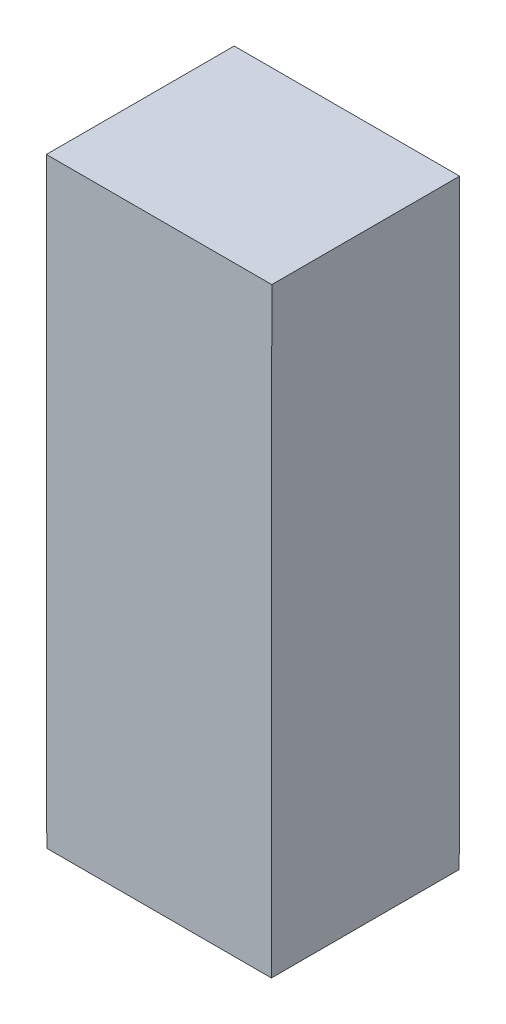
ISO-10303-21;
HEADER;
FILE_DESCRIPTION(('STEP AP214'),'2;1');
FILE_NAME('part.step','',(''),(''),'','','');
FILE_SCHEMA(('AUTOMOTIVE_DESIGN { 1 0 10303 214 1 1 1 1 }'));
ENDSEC;
DATA;
#1=APPLICATION_CONTEXT('core data for automotive mechanical design processes');
#2=APPLICATION_PROTOCOL_DEFINITION('international standard','automotive_design',2000,#1);
#3=PRODUCT_CONTEXT('',#1,'mechanical');
#4=PRODUCT('Part','Part','',(#3));
#5=PRODUCT_RELATED_PRODUCT_CATEGORY('part','',(#4));
#6=PRODUCT_DEFINITION_FORMATION('','',#4);
#7=PRODUCT_DEFINITION_CONTEXT('part definition',#1,'design');
#8=PRODUCT_DEFINITION('design','',#6,#7);
#9=PRODUCT_DEFINITION_SHAPE('','',#8);
#10=(LENGTH_UNIT() NAMED_UNIT(*) SI_UNIT(.MILLI.,.METRE.));
#11=(NAMED_UNIT(*) PLANE_ANGLE_UNIT() SI_UNIT($,.RADIAN.));
#12=(NAMED_UNIT(*) SI_UNIT($,.STERADIAN.) SOLID_ANGLE_UNIT());
#13=UNCERTAINTY_MEASURE_WITH_UNIT(LENGTH_MEASURE(1.E-05),#10,'distance_accuracy_value','');
#14=(GEOMETRIC_REPRESENTATION_CONTEXT(3) GLOBAL_UNCERTAINTY_ASSIGNED_CONTEXT((#13)) GLOBAL_UNIT_ASSIGNED_CONTEXT((#10,
#11,#12)) REPRESENTATION_CONTEXT('',''));
#15=CARTESIAN_POINT('',(0.,0.,0.));
#16=DIRECTION('',(0.,0.,1.));
#17=DIRECTION('',(1.,0.,0.));
#18=AXIS2_PLACEMENT_3D('',#15,#16,#17);
#19=CARTESIAN_POINT('',(-0.1494917,-0.39974266,0.2499995));
#20=DIRECTION('',(0.,0.,1.));
#21=DIRECTION('',(1.,0.,0.));
#22=AXIS2_PLACEMENT_3D('',#19,#20,#21);
#23=PLANE('',#22);
#24=DIRECTION('',(1.,0.,0.));
#25=VECTOR('',#24,1.);
#26=CARTESIAN_POINT('',(-0.1499997,0.3997452,0.2499995));
#27=LINE('',#26,#25);
#28=CARTESIAN_POINT('',(-0.149999700000003,0.3997452,0.2499995));
#29=VERTEX_POINT('',#28);
#30=CARTESIAN_POINT('',(0.1499997,0.3997452,0.2499995));
#31=VERTEX_POINT('',#30);
#32=EDGE_CURVE('E87',#29,#31,#27,.T.);
#33=ORIENTED_EDGE('',*,*,#32,.F.);
#34=DIRECTION('',(0.000635406643273413,-0.999999798129178,0.));
#35=VECTOR('',#34,1.);
#36=CARTESIAN_POINT('',(-0.1494917,-0.39974266,0.2499995));
#37=LINE('',#36,#35);
#38=CARTESIAN_POINT('',(-0.1494917,-0.399742660000002,0.2499995));
#39=VERTEX_POINT('',#38);
#40=EDGE_CURVE('E76',#39,#29,#37,.F.);
#41=ORIENTED_EDGE('',*,*,#40,.F.);
#42=DIRECTION('',(0.999999999855655,-1.69909098406741E-05,0.));
#43=VECTOR('',#42,1.);
#44=CARTESIAN_POINT('',(0.,-0.3997452,0.2499995));
#45=LINE('',#44,#43);
#46=CARTESIAN_POINT('',(0.,-0.399745199999999,0.2499995));
#47=VERTEX_POINT('',#46);
#48=EDGE_CURVE('E20',#47,#39,#45,.F.);
#49=ORIENTED_EDGE('',*,*,#48,.F.);
#50=DIRECTION('',(0.999999999855655,1.69909098406741E-05,0.));
#51=VECTOR('',#50,1.);
#52=CARTESIAN_POINT('',(0.1494917,-0.39974266,0.2499995));
#53=LINE('',#52,#51);
#54=CARTESIAN_POINT('',(0.149491699193034,-0.39974393,0.2499995));
#55=VERTEX_POINT('',#54);
#56=EDGE_CURVE('E65',#55,#47,#53,.F.);
#57=ORIENTED_EDGE('',*,*,#56,.F.);
#58=DIRECTION('',(0.000635406643255613,0.999999798129178,0.));
#59=VECTOR('',#58,1.);
#60=CARTESIAN_POINT('',(0.1499997,0.3997452,0.2499995));
#61=LINE('',#60,#59);
#62=EDGE_CURVE('E60',#31,#55,#61,.F.);
#63=ORIENTED_EDGE('',*,*,#62,.F.);
#64=EDGE_LOOP('',(#33,#41,#49,#57,#63));
#65=FACE_BOUND('',#64,.T.);
#66=ADVANCED_FACE('F17',(#65),#23,.T.);
#67=CARTESIAN_POINT('',(0.,-0.3997452,0.));
#68=DIRECTION('',(-1.69909098406741E-05,-0.999999999855655,0.));
#69=DIRECTION('',(0.999999999855655,-1.69909098406741E-05,0.));
#70=AXIS2_PLACEMENT_3D('',#67,#68,#69);
#71=PLANE('',#70);
#72=DIRECTION('',(0.,0.,1.));
#73=VECTOR('',#72,1.);
#74=CARTESIAN_POINT('',(-0.1494917,-0.39974266,0.));
#75=LINE('',#74,#73);
#76=CARTESIAN_POINT('',(-0.1494917,-0.399742660000002,0.));
#77=VERTEX_POINT('',#76);
#78=EDGE_CURVE('E91',#77,#39,#75,.T.);
#79=ORIENTED_EDGE('',*,*,#78,.F.);
#80=DIRECTION('',(1.,0.,0.));
#81=VECTOR('',#80,1.);
#82=CARTESIAN_POINT('',(-0.1494917,-0.39974266,0.));
#83=LINE('',#82,#81);
#84=CARTESIAN_POINT('',(0.,-0.399745199999999,0.));
#85=VERTEX_POINT('',#84);
#86=EDGE_CURVE('E82',#77,#85,#83,.T.);
#87=ORIENTED_EDGE('',*,*,#86,.T.);
#88=DIRECTION('',(0.,0.,1.));
#89=VECTOR('',#88,1.);
#90=CARTESIAN_POINT('',(0.,-0.399745199999997,0.));
#91=LINE('',#90,#89);
#92=EDGE_CURVE('E70',#47,#85,#91,.F.);
#93=ORIENTED_EDGE('',*,*,#92,.F.);
#94=ORIENTED_EDGE('',*,*,#48,.T.);
#95=EDGE_LOOP('',(#79,#87,#93,#94));
#96=FACE_BOUND('',#95,.T.);
#97=ADVANCED_FACE('F81',(#96),#71,.T.);
#98=CARTESIAN_POINT('',(0.1494917,-0.39974266,0.));
#99=DIRECTION('',(1.69909098406741E-05,-0.999999999855655,0.));
#100=DIRECTION('',(0.999999999855655,1.69909098406741E-05,0.));
#101=AXIS2_PLACEMENT_3D('',#98,#99,#100);
#102=PLANE('',#101);
#103=ORIENTED_EDGE('',*,*,#92,.T.);
#104=DIRECTION('',(1.,0.,0.));
#105=VECTOR('',#104,1.);
#106=CARTESIAN_POINT('',(-0.1494917,-0.3997452,0.));
#107=LINE('',#106,#105);
#108=CARTESIAN_POINT('',(0.149491699596518,-0.399743295,0.));
#109=VERTEX_POINT('',#108);
#110=EDGE_CURVE('E96',#85,#109,#107,.T.);
#111=ORIENTED_EDGE('',*,*,#110,.T.);
#112=DIRECTION('',(0.,0.,1.));
#113=VECTOR('',#112,1.);
#114=CARTESIAN_POINT('',(0.149491700000003,-0.39974266,0.));
#115=LINE('',#114,#113);
#116=EDGE_CURVE('E72',#55,#109,#115,.F.);
#117=ORIENTED_EDGE('',*,*,#116,.F.);
#118=ORIENTED_EDGE('',*,*,#56,.T.);
#119=EDGE_LOOP('',(#103,#111,#117,#118));
#120=FACE_BOUND('',#119,.T.);
#121=ADVANCED_FACE('F67',(#120),#102,.T.);
#122=CARTESIAN_POINT('',(0.1499997,0.3997452,0.));
#123=DIRECTION('',(0.999999798129178,-0.000635406643255613,0.));
#124=DIRECTION('',(0.000635406643255613,0.999999798129178,0.));
#125=AXIS2_PLACEMENT_3D('',#122,#123,#124);
#126=PLANE('',#125);
#127=ORIENTED_EDGE('',*,*,#116,.T.);
#128=DIRECTION('',(0.000635406643259914,0.999999798129178,0.));
#129=VECTOR('',#128,1.);
#130=CARTESIAN_POINT('',(0.1494917,-0.39974266,0.));
#131=LINE('',#130,#129);
#132=CARTESIAN_POINT('',(0.1499997,0.3997452,0.));
#133=VERTEX_POINT('',#132);
#134=EDGE_CURVE('E98',#109,#133,#131,.T.);
#135=ORIENTED_EDGE('',*,*,#134,.T.);
#136=DIRECTION('',(0.,0.,1.));
#137=VECTOR('',#136,1.);
#138=CARTESIAN_POINT('',(0.1499997,0.3997452,0.));
#139=LINE('',#138,#137);
#140=EDGE_CURVE('E89',#31,#133,#139,.F.);
#141=ORIENTED_EDGE('',*,*,#140,.F.);
#142=ORIENTED_EDGE('',*,*,#62,.T.);
#143=EDGE_LOOP('',(#127,#135,#141,#142));
#144=FACE_BOUND('',#143,.T.);
#145=ADVANCED_FACE('F108',(#144),#126,.T.);
#146=CARTESIAN_POINT('',(-0.1499997,0.3997452,0.));
#147=DIRECTION('',(0.,1.,0.));
#148=DIRECTION('',(0.,0.,1.));
#149=AXIS2_PLACEMENT_3D('',#146,#147,#148);
#150=PLANE('',#149);
#151=ORIENTED_EDGE('',*,*,#140,.T.);
#152=DIRECTION('',(1.,0.,0.));
#153=VECTOR('',#152,1.);
#154=CARTESIAN_POINT('',(-0.1494917,0.3997452,0.));
#155=LINE('',#154,#153);
#156=CARTESIAN_POINT('',(-0.149999700000003,0.3997452,0.));
#157=VERTEX_POINT('',#156);
#158=EDGE_CURVE('E26',#133,#157,#155,.F.);
#159=ORIENTED_EDGE('',*,*,#158,.T.);
#160=DIRECTION('',(0.,0.,1.));
#161=VECTOR('',#160,1.);
#162=CARTESIAN_POINT('',(-0.149999700000011,0.3997452,0.));
#163=LINE('',#162,#161);
#164=EDGE_CURVE('E34',#29,#157,#163,.F.);
#165=ORIENTED_EDGE('',*,*,#164,.F.);
#166=ORIENTED_EDGE('',*,*,#32,.T.);
#167=EDGE_LOOP('',(#151,#159,#165,#166));
#168=FACE_BOUND('',#167,.T.);
#169=ADVANCED_FACE('F104',(#168),#150,.T.);
#170=CARTESIAN_POINT('',(-0.1494917,-0.39974266,0.));
#171=DIRECTION('',(-0.999999798129178,-0.000635406643273413,0.));
#172=DIRECTION('',(0.000635406643273413,-0.999999798129178,0.));
#173=AXIS2_PLACEMENT_3D('',#170,#171,#172);
#174=PLANE('',#173);
#175=ORIENTED_EDGE('',*,*,#164,.T.);
#176=DIRECTION('',(0.000635406643259881,-0.999999798129178,0.));
#177=VECTOR('',#176,1.);
#178=CARTESIAN_POINT('',(-0.1499997,0.3997452,0.));
#179=LINE('',#178,#177);
#180=EDGE_CURVE('E11',#157,#77,#179,.T.);
#181=ORIENTED_EDGE('',*,*,#180,.T.);
#182=ORIENTED_EDGE('',*,*,#78,.T.);
#183=ORIENTED_EDGE('',*,*,#40,.T.);
#184=EDGE_LOOP('',(#175,#181,#182,#183));
#185=FACE_BOUND('',#184,.T.);
#186=ADVANCED_FACE('F116',(#185),#174,.T.);
#187=CARTESIAN_POINT('',(-0.1494917,-0.39974266,0.));
#188=DIRECTION('',(0.,0.,1.));
#189=DIRECTION('',(1.,0.,0.));
#190=AXIS2_PLACEMENT_3D('',#187,#188,#189);
#191=PLANE('',#190);
#192=ORIENTED_EDGE('',*,*,#158,.F.);
#193=ORIENTED_EDGE('',*,*,#134,.F.);
#194=ORIENTED_EDGE('',*,*,#110,.F.);
#195=ORIENTED_EDGE('',*,*,#86,.F.);
#196=ORIENTED_EDGE('',*,*,#180,.F.);
#197=EDGE_LOOP('',(#192,#193,#194,#195,#196));
#198=FACE_BOUND('',#197,.T.);
#199=ADVANCED_FACE('F107',(#198),#191,.F.);
#200=CLOSED_SHELL('',(#66,#97,#121,#145,#169,#186,#199));
#201=MANIFOLD_SOLID_BREP('B1',#200);
#202=ADVANCED_BREP_SHAPE_REPRESENTATION('',(#18,#201),#14);
#203=SHAPE_DEFINITION_REPRESENTATION(#9,#202);
ENDSEC;
END-ISO-10303-21;
